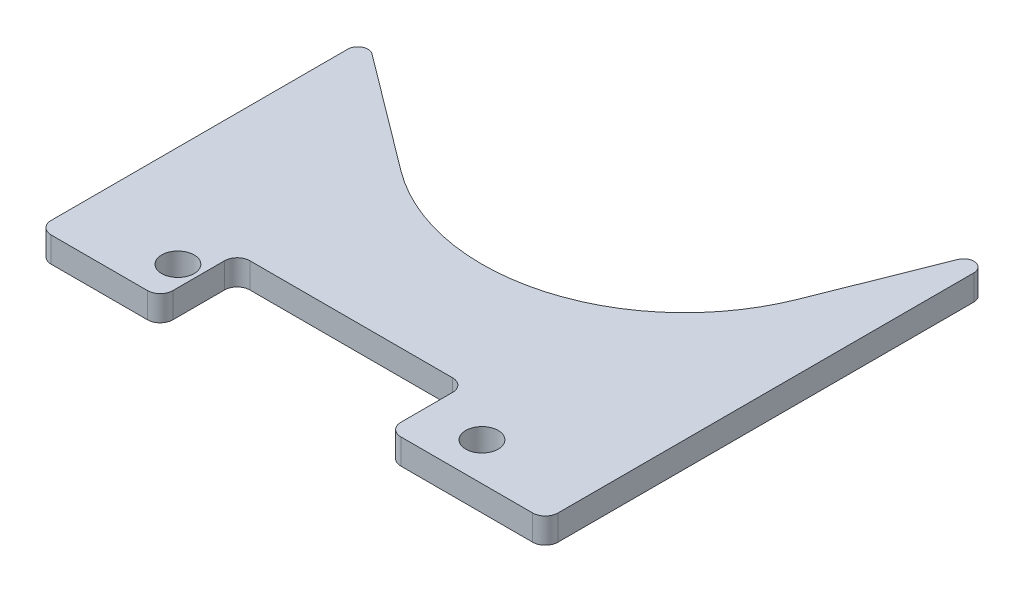
ISO-10303-21;
HEADER;
FILE_DESCRIPTION(('STEP AP214'),'2;1');
FILE_NAME('part.step','',(''),(''),'','','');
FILE_SCHEMA(('AUTOMOTIVE_DESIGN { 1 0 10303 214 1 1 1 1 }'));
ENDSEC;
DATA;
#1=APPLICATION_CONTEXT('core data for automotive mechanical design processes');
#2=APPLICATION_PROTOCOL_DEFINITION('international standard','automotive_design',2000,#1);
#3=PRODUCT_CONTEXT('',#1,'mechanical');
#4=PRODUCT('Part','Part','',(#3));
#5=PRODUCT_RELATED_PRODUCT_CATEGORY('part','',(#4));
#6=PRODUCT_DEFINITION_FORMATION('','',#4);
#7=PRODUCT_DEFINITION_CONTEXT('part definition',#1,'design');
#8=PRODUCT_DEFINITION('design','',#6,#7);
#9=PRODUCT_DEFINITION_SHAPE('','',#8);
#10=(LENGTH_UNIT() NAMED_UNIT(*) SI_UNIT(.MILLI.,.METRE.));
#11=(NAMED_UNIT(*) PLANE_ANGLE_UNIT() SI_UNIT($,.RADIAN.));
#12=(NAMED_UNIT(*) SI_UNIT($,.STERADIAN.) SOLID_ANGLE_UNIT());
#13=UNCERTAINTY_MEASURE_WITH_UNIT(LENGTH_MEASURE(1.E-05),#10,'distance_accuracy_value','');
#14=(GEOMETRIC_REPRESENTATION_CONTEXT(3) GLOBAL_UNCERTAINTY_ASSIGNED_CONTEXT((#13)) GLOBAL_UNIT_ASSIGNED_CONTEXT((#10,
#11,#12)) REPRESENTATION_CONTEXT('',''));
#15=CARTESIAN_POINT('',(0.,0.,0.));
#16=DIRECTION('',(0.,0.,1.));
#17=DIRECTION('',(1.,0.,0.));
#18=AXIS2_PLACEMENT_3D('',#15,#16,#17);
#19=CARTESIAN_POINT('',(-31.75,3.175,30.1625));
#20=DIRECTION('',(0.,0.,-1.));
#21=DIRECTION('',(-1.,0.,0.));
#22=AXIS2_PLACEMENT_3D('',#19,#20,#21);
#23=PLANE('',#22);
#24=DIRECTION('',(1.,0.,0.));
#25=VECTOR('',#24,1.);
#26=CARTESIAN_POINT('',(-31.75,3.175,30.1625));
#27=LINE('',#26,#25);
#28=CARTESIAN_POINT('',(-30.1625,3.175,30.1625));
#29=VERTEX_POINT('',#28);
#30=CARTESIAN_POINT('',(-18.0975,3.175,30.1625));
#31=VERTEX_POINT('',#30);
#32=EDGE_CURVE('E323',#29,#31,#27,.T.);
#33=ORIENTED_EDGE('',*,*,#32,.F.);
#34=DIRECTION('',(0.,-1.,0.));
#35=VECTOR('',#34,1.);
#36=CARTESIAN_POINT('',(-30.1625,3.175,30.1625));
#37=LINE('',#36,#35);
#38=CARTESIAN_POINT('',(-30.1625,0.,30.1625));
#39=VERTEX_POINT('',#38);
#40=EDGE_CURVE('E343',#29,#39,#37,.T.);
#41=ORIENTED_EDGE('',*,*,#40,.T.);
#42=DIRECTION('',(1.,0.,0.));
#43=VECTOR('',#42,1.);
#44=CARTESIAN_POINT('',(-31.75,0.,30.1625));
#45=LINE('',#44,#43);
#46=CARTESIAN_POINT('',(-18.0975,0.,30.1625));
#47=VERTEX_POINT('',#46);
#48=EDGE_CURVE('E338',#39,#47,#45,.T.);
#49=ORIENTED_EDGE('',*,*,#48,.T.);
#50=DIRECTION('',(0.,1.,0.));
#51=VECTOR('',#50,1.);
#52=CARTESIAN_POINT('',(-18.0975,3.175,30.1625));
#53=LINE('',#52,#51);
#54=EDGE_CURVE('E339',#47,#31,#53,.T.);
#55=ORIENTED_EDGE('',*,*,#54,.T.);
#56=EDGE_LOOP('',(#33,#41,#49,#55));
#57=FACE_BOUND('',#56,.T.);
#58=ADVANCED_FACE('F52',(#57),#23,.F.);
#59=CARTESIAN_POINT('',(31.75,3.175,-30.1625));
#60=DIRECTION('',(-1.,0.,0.));
#61=DIRECTION('',(0.,0.,1.));
#62=AXIS2_PLACEMENT_3D('',#59,#60,#61);
#63=PLANE('',#62);
#64=DIRECTION('',(0.,0.,-1.));
#65=VECTOR('',#64,1.);
#66=CARTESIAN_POINT('',(31.75,0.,-30.1625));
#67=LINE('',#66,#65);
#68=CARTESIAN_POINT('',(31.75,0.,28.575));
#69=VERTEX_POINT('',#68);
#70=CARTESIAN_POINT('',(31.75,0.,-23.5291490333497));
#71=VERTEX_POINT('',#70);
#72=EDGE_CURVE('E289',#69,#71,#67,.T.);
#73=ORIENTED_EDGE('',*,*,#72,.T.);
#74=DIRECTION('',(0.,-1.,0.));
#75=VECTOR('',#74,1.);
#76=CARTESIAN_POINT('',(31.75,3.175,-23.5291490333497));
#77=LINE('',#76,#75);
#78=CARTESIAN_POINT('',(31.75,3.175,-23.5291490333497));
#79=VERTEX_POINT('',#78);
#80=EDGE_CURVE('E442',#71,#79,#77,.F.);
#81=ORIENTED_EDGE('',*,*,#80,.T.);
#82=DIRECTION('',(0.,0.,-1.));
#83=VECTOR('',#82,1.);
#84=CARTESIAN_POINT('',(31.75,3.175,-30.1625));
#85=LINE('',#84,#83);
#86=CARTESIAN_POINT('',(31.75,3.175,28.575));
#87=VERTEX_POINT('',#86);
#88=EDGE_CURVE('E380',#87,#79,#85,.T.);
#89=ORIENTED_EDGE('',*,*,#88,.F.);
#90=DIRECTION('',(0.,-1.,0.));
#91=VECTOR('',#90,1.);
#92=CARTESIAN_POINT('',(31.75,3.175,28.575));
#93=LINE('',#92,#91);
#94=EDGE_CURVE('E420',#87,#69,#93,.T.);
#95=ORIENTED_EDGE('',*,*,#94,.T.);
#96=EDGE_LOOP('',(#73,#81,#89,#95));
#97=FACE_BOUND('',#96,.T.);
#98=ADVANCED_FACE('F464',(#97),#63,.F.);
#99=CARTESIAN_POINT('',(-31.75,3.175,-30.1625));
#100=DIRECTION('',(1.,0.,0.));
#101=DIRECTION('',(0.,0.,-1.));
#102=AXIS2_PLACEMENT_3D('',#99,#100,#101);
#103=PLANE('',#102);
#104=DIRECTION('',(0.,0.,1.));
#105=VECTOR('',#104,1.);
#106=CARTESIAN_POINT('',(-31.75,3.175,-30.1625));
#107=LINE('',#106,#105);
#108=CARTESIAN_POINT('',(-31.75,3.175,-8.5725));
#109=VERTEX_POINT('',#108);
#110=CARTESIAN_POINT('',(-31.75,3.175,28.575));
#111=VERTEX_POINT('',#110);
#112=EDGE_CURVE('E324',#109,#111,#107,.T.);
#113=ORIENTED_EDGE('',*,*,#112,.F.);
#114=DIRECTION('',(0.,1.,0.));
#115=VECTOR('',#114,1.);
#116=CARTESIAN_POINT('',(-31.75,3.175,-8.5725));
#117=LINE('',#116,#115);
#118=CARTESIAN_POINT('',(-31.75,0.,-8.5725));
#119=VERTEX_POINT('',#118);
#120=EDGE_CURVE('E12',#109,#119,#117,.F.);
#121=ORIENTED_EDGE('',*,*,#120,.T.);
#122=DIRECTION('',(0.,0.,1.));
#123=VECTOR('',#122,1.);
#124=CARTESIAN_POINT('',(-31.75,0.,-30.1625));
#125=LINE('',#124,#123);
#126=CARTESIAN_POINT('',(-31.75,0.,28.575));
#127=VERTEX_POINT('',#126);
#128=EDGE_CURVE('E331',#119,#127,#125,.T.);
#129=ORIENTED_EDGE('',*,*,#128,.T.);
#130=DIRECTION('',(0.,-1.,0.));
#131=VECTOR('',#130,1.);
#132=CARTESIAN_POINT('',(-31.75,3.175,28.575));
#133=LINE('',#132,#131);
#134=EDGE_CURVE('E302',#127,#111,#133,.F.);
#135=ORIENTED_EDGE('',*,*,#134,.T.);
#136=EDGE_LOOP('',(#113,#121,#129,#135));
#137=FACE_BOUND('',#136,.T.);
#138=ADVANCED_FACE('F365',(#137),#103,.F.);
#139=CARTESIAN_POINT('',(13.6525,3.175,30.1625));
#140=VERTEX_POINT('',#139);
#141=CARTESIAN_POINT('',(30.1625,3.175,30.1625));
#142=VERTEX_POINT('',#141);
#143=EDGE_CURVE('E318',#140,#142,#27,.T.);
#144=ORIENTED_EDGE('',*,*,#143,.F.);
#145=DIRECTION('',(0.,1.,0.));
#146=VECTOR('',#145,1.);
#147=CARTESIAN_POINT('',(13.6525,3.175,30.1625));
#148=LINE('',#147,#146);
#149=CARTESIAN_POINT('',(13.6525,0.,30.1625));
#150=VERTEX_POINT('',#149);
#151=EDGE_CURVE('E412',#140,#150,#148,.F.);
#152=ORIENTED_EDGE('',*,*,#151,.T.);
#153=CARTESIAN_POINT('',(30.1625,0.,30.1625));
#154=VERTEX_POINT('',#153);
#155=EDGE_CURVE('E334',#150,#154,#45,.T.);
#156=ORIENTED_EDGE('',*,*,#155,.T.);
#157=DIRECTION('',(0.,-1.,0.));
#158=VECTOR('',#157,1.);
#159=CARTESIAN_POINT('',(30.1625,3.175,30.1625));
#160=LINE('',#159,#158);
#161=EDGE_CURVE('E408',#154,#142,#160,.F.);
#162=ORIENTED_EDGE('',*,*,#161,.T.);
#163=EDGE_LOOP('',(#144,#152,#156,#162));
#164=FACE_BOUND('',#163,.T.);
#165=ADVANCED_FACE('F475',(#164),#23,.F.);
#166=CARTESIAN_POINT('',(0.,3.175,0.));
#167=DIRECTION('',(0.,1.,0.));
#168=DIRECTION('',(0.,0.,1.));
#169=AXIS2_PLACEMENT_3D('',#166,#167,#168);
#170=PLANE('',#169);
#171=ORIENTED_EDGE('',*,*,#88,.T.);
#172=CARTESIAN_POINT('',(30.48,3.175,-23.5291490333497));
#173=DIRECTION('',(0.,1.,0.));
#174=DIRECTION('',(0.,0.,1.));
#175=AXIS2_PLACEMENT_3D('',#172,#173,#174);
#176=CIRCLE('',#175,1.27);
#177=CARTESIAN_POINT('',(29.2998133027479,3.175,-23.9982538826415));
#178=VERTEX_POINT('',#177);
#179=EDGE_CURVE('E447',#79,#178,#176,.T.);
#180=ORIENTED_EDGE('',*,*,#179,.T.);
#181=DIRECTION('',(0.369373897080169,0.,-0.929280863978059));
#182=VECTOR('',#181,1.);
#183=CARTESIAN_POINT('',(23.6037339450427,3.175,-9.66790301416369));
#184=LINE('',#183,#182);
#185=CARTESIAN_POINT('',(23.6037339450427,3.175,-9.66790301416369));
#186=VERTEX_POINT('',#185);
#187=EDGE_CURVE('E231',#186,#178,#184,.T.);
#188=ORIENTED_EDGE('',*,*,#187,.F.);
#189=CARTESIAN_POINT('',(0.,3.175,-19.05));
#190=DIRECTION('',(0.,1.,0.));
#191=DIRECTION('',(0.,0.,1.));
#192=AXIS2_PLACEMENT_3D('',#189,#190,#191);
#193=CIRCLE('',#192,25.4);
#194=CARTESIAN_POINT('',(-15.24,3.175,1.27));
#195=VERTEX_POINT('',#194);
#196=EDGE_CURVE('E207',#195,#186,#193,.T.);
#197=ORIENTED_EDGE('',*,*,#196,.F.);
#198=DIRECTION('',(0.8,0.,0.599999999999999));
#199=VECTOR('',#198,1.);
#200=CARTESIAN_POINT('',(-15.24,3.175,1.27));
#201=LINE('',#200,#199);
#202=CARTESIAN_POINT('',(-29.718,3.175,-9.5885));
#203=VERTEX_POINT('',#202);
#204=EDGE_CURVE('E228',#203,#195,#201,.T.);
#205=ORIENTED_EDGE('',*,*,#204,.F.);
#206=CARTESIAN_POINT('',(-30.48,3.175,-8.5725));
#207=DIRECTION('',(0.,1.,0.));
#208=DIRECTION('',(0.,0.,1.));
#209=AXIS2_PLACEMENT_3D('',#206,#207,#208);
#210=CIRCLE('',#209,1.27);
#211=EDGE_CURVE('E68',#203,#109,#210,.T.);
#212=ORIENTED_EDGE('',*,*,#211,.T.);
#213=ORIENTED_EDGE('',*,*,#112,.T.);
#214=CARTESIAN_POINT('',(-30.1625,3.175,28.575));
#215=DIRECTION('',(0.,1.,0.));
#216=DIRECTION('',(0.,0.,1.));
#217=AXIS2_PLACEMENT_3D('',#214,#215,#216);
#218=CIRCLE('',#217,1.5875);
#219=EDGE_CURVE('E310',#111,#29,#218,.T.);
#220=ORIENTED_EDGE('',*,*,#219,.T.);
#221=ORIENTED_EDGE('',*,*,#32,.T.);
#222=CARTESIAN_POINT('',(-18.0975,3.175,28.575));
#223=DIRECTION('',(0.,1.,0.));
#224=DIRECTION('',(0.,0.,1.));
#225=AXIS2_PLACEMENT_3D('',#222,#223,#224);
#226=CIRCLE('',#225,1.5875);
#227=CARTESIAN_POINT('',(-16.51,3.175,28.575));
#228=VERTEX_POINT('',#227);
#229=EDGE_CURVE('E306',#31,#228,#226,.T.);
#230=ORIENTED_EDGE('',*,*,#229,.T.);
#231=DIRECTION('',(0.,0.,1.));
#232=VECTOR('',#231,1.);
#233=CARTESIAN_POINT('',(-16.51,3.175,30.1625));
#234=LINE('',#233,#232);
#235=CARTESIAN_POINT('',(-16.51,3.175,22.098));
#236=VERTEX_POINT('',#235);
#237=EDGE_CURVE('E250',#236,#228,#234,.T.);
#238=ORIENTED_EDGE('',*,*,#237,.F.);
#239=CARTESIAN_POINT('',(-14.9225,3.175,22.098));
#240=DIRECTION('',(0.,1.,0.));
#241=DIRECTION('',(0.,0.,1.));
#242=AXIS2_PLACEMENT_3D('',#239,#240,#241);
#243=CIRCLE('',#242,1.5875);
#244=CARTESIAN_POINT('',(-14.9225,3.175,20.5105));
#245=VERTEX_POINT('',#244);
#246=EDGE_CURVE('E424',#236,#245,#243,.F.);
#247=ORIENTED_EDGE('',*,*,#246,.T.);
#248=DIRECTION('',(-1.,0.,0.));
#249=VECTOR('',#248,1.);
#250=CARTESIAN_POINT('',(-16.51,3.175,20.5105));
#251=LINE('',#250,#249);
#252=CARTESIAN_POINT('',(10.4775,3.175,20.5105));
#253=VERTEX_POINT('',#252);
#254=EDGE_CURVE('E257',#253,#245,#251,.T.);
#255=ORIENTED_EDGE('',*,*,#254,.F.);
#256=CARTESIAN_POINT('',(10.4775,3.175,22.098));
#257=DIRECTION('',(0.,1.,0.));
#258=DIRECTION('',(0.,0.,1.));
#259=AXIS2_PLACEMENT_3D('',#256,#257,#258);
#260=CIRCLE('',#259,1.5875);
#261=CARTESIAN_POINT('',(12.065,3.175,22.098));
#262=VERTEX_POINT('',#261);
#263=EDGE_CURVE('E404',#253,#262,#260,.F.);
#264=ORIENTED_EDGE('',*,*,#263,.T.);
#265=DIRECTION('',(0.,0.,-1.));
#266=VECTOR('',#265,1.);
#267=CARTESIAN_POINT('',(12.065,3.175,30.1625));
#268=LINE('',#267,#266);
#269=CARTESIAN_POINT('',(12.065,3.175,28.575));
#270=VERTEX_POINT('',#269);
#271=EDGE_CURVE('E270',#270,#262,#268,.T.);
#272=ORIENTED_EDGE('',*,*,#271,.F.);
#273=CARTESIAN_POINT('',(13.6525,3.175,28.575));
#274=DIRECTION('',(0.,1.,0.));
#275=DIRECTION('',(0.,0.,1.));
#276=AXIS2_PLACEMENT_3D('',#273,#274,#275);
#277=CIRCLE('',#276,1.5875);
#278=EDGE_CURVE('E301',#270,#140,#277,.T.);
#279=ORIENTED_EDGE('',*,*,#278,.T.);
#280=ORIENTED_EDGE('',*,*,#143,.T.);
#281=CARTESIAN_POINT('',(30.1625,3.175,28.575));
#282=DIRECTION('',(0.,1.,0.));
#283=DIRECTION('',(0.,0.,1.));
#284=AXIS2_PLACEMENT_3D('',#281,#282,#283);
#285=CIRCLE('',#284,1.5875);
#286=EDGE_CURVE('E296',#142,#87,#285,.T.);
#287=ORIENTED_EDGE('',*,*,#286,.T.);
#288=EDGE_LOOP('',(#171,#180,#188,#197,#205,#212,#213,#220,#221,#230,#238,#247,#255,#264,#272,
#279,#280,#287));
#289=FACE_BOUND('',#288,.T.);
#290=CARTESIAN_POINT('',(19.05,3.175,25.4));
#291=DIRECTION('',(0.,-1.,0.));
#292=DIRECTION('',(0.,0.,-1.));
#293=AXIS2_PLACEMENT_3D('',#290,#291,#292);
#294=CIRCLE('',#293,2.032);
#295=CARTESIAN_POINT('',(19.05,3.175,23.368));
#296=VERTEX_POINT('',#295);
#297=EDGE_CURVE('E284',#296,#296,#294,.T.);
#298=ORIENTED_EDGE('',*,*,#297,.T.);
#299=EDGE_LOOP('',(#298));
#300=FACE_BOUND('',#299,.T.);
#301=CARTESIAN_POINT('',(-19.05,3.175,25.4));
#302=DIRECTION('',(0.,-1.,0.));
#303=DIRECTION('',(0.,0.,-1.));
#304=AXIS2_PLACEMENT_3D('',#301,#302,#303);
#305=CIRCLE('',#304,2.032);
#306=CARTESIAN_POINT('',(-19.05,3.175,23.368));
#307=VERTEX_POINT('',#306);
#308=EDGE_CURVE('E265',#307,#307,#305,.T.);
#309=ORIENTED_EDGE('',*,*,#308,.T.);
#310=EDGE_LOOP('',(#309));
#311=FACE_BOUND('',#310,.T.);
#312=ADVANCED_FACE('F372',(#289,#300,#311),#170,.T.);
#313=CARTESIAN_POINT('',(0.,0.,0.));
#314=DIRECTION('',(0.,1.,0.));
#315=DIRECTION('',(0.,0.,1.));
#316=AXIS2_PLACEMENT_3D('',#313,#314,#315);
#317=PLANE('',#316);
#318=CARTESIAN_POINT('',(19.05,0.,25.4));
#319=DIRECTION('',(0.,-1.,0.));
#320=DIRECTION('',(0.,0.,-1.));
#321=AXIS2_PLACEMENT_3D('',#318,#319,#320);
#322=CIRCLE('',#321,2.032);
#323=CARTESIAN_POINT('',(19.05,0.,23.368));
#324=VERTEX_POINT('',#323);
#325=EDGE_CURVE('E290',#324,#324,#322,.T.);
#326=ORIENTED_EDGE('',*,*,#325,.F.);
#327=EDGE_LOOP('',(#326));
#328=FACE_BOUND('',#327,.T.);
#329=CARTESIAN_POINT('',(-19.05,0.,25.4));
#330=DIRECTION('',(0.,-1.,0.));
#331=DIRECTION('',(0.,0.,-1.));
#332=AXIS2_PLACEMENT_3D('',#329,#330,#331);
#333=CIRCLE('',#332,2.032);
#334=CARTESIAN_POINT('',(-19.05,0.,23.368));
#335=VERTEX_POINT('',#334);
#336=EDGE_CURVE('E385',#335,#335,#333,.T.);
#337=ORIENTED_EDGE('',*,*,#336,.F.);
#338=EDGE_LOOP('',(#337));
#339=FACE_BOUND('',#338,.T.);
#340=DIRECTION('',(0.369373897080169,0.,-0.929280863978059));
#341=VECTOR('',#340,1.);
#342=CARTESIAN_POINT('',(23.6037339450427,0.,-9.66790301416369));
#343=LINE('',#342,#341);
#344=CARTESIAN_POINT('',(23.6037339450427,0.,-9.66790301416369));
#345=VERTEX_POINT('',#344);
#346=CARTESIAN_POINT('',(29.2998133027479,0.,-23.9982538826415));
#347=VERTEX_POINT('',#346);
#348=EDGE_CURVE('E217',#345,#347,#343,.T.);
#349=ORIENTED_EDGE('',*,*,#348,.T.);
#350=CARTESIAN_POINT('',(30.48,0.,-23.5291490333497));
#351=DIRECTION('',(0.,1.,0.));
#352=DIRECTION('',(0.,0.,1.));
#353=AXIS2_PLACEMENT_3D('',#350,#351,#352);
#354=CIRCLE('',#353,1.27);
#355=EDGE_CURVE('E439',#347,#71,#354,.F.);
#356=ORIENTED_EDGE('',*,*,#355,.T.);
#357=ORIENTED_EDGE('',*,*,#72,.F.);
#358=CARTESIAN_POINT('',(30.1625,0.,28.575));
#359=DIRECTION('',(0.,1.,0.));
#360=DIRECTION('',(0.,0.,1.));
#361=AXIS2_PLACEMENT_3D('',#358,#359,#360);
#362=CIRCLE('',#361,1.5875);
#363=EDGE_CURVE('E347',#69,#154,#362,.F.);
#364=ORIENTED_EDGE('',*,*,#363,.T.);
#365=ORIENTED_EDGE('',*,*,#155,.F.);
#366=CARTESIAN_POINT('',(13.6525,0.,28.575));
#367=DIRECTION('',(0.,1.,0.));
#368=DIRECTION('',(0.,0.,1.));
#369=AXIS2_PLACEMENT_3D('',#366,#367,#368);
#370=CIRCLE('',#369,1.5875);
#371=CARTESIAN_POINT('',(12.065,0.,28.575));
#372=VERTEX_POINT('',#371);
#373=EDGE_CURVE('E350',#150,#372,#370,.F.);
#374=ORIENTED_EDGE('',*,*,#373,.T.);
#375=DIRECTION('',(0.,0.,-1.));
#376=VECTOR('',#375,1.);
#377=CARTESIAN_POINT('',(12.065,0.,30.1625));
#378=LINE('',#377,#376);
#379=CARTESIAN_POINT('',(12.065,0.,22.098));
#380=VERTEX_POINT('',#379);
#381=EDGE_CURVE('E256',#372,#380,#378,.T.);
#382=ORIENTED_EDGE('',*,*,#381,.T.);
#383=CARTESIAN_POINT('',(10.4775,0.,22.098));
#384=DIRECTION('',(0.,1.,0.));
#385=DIRECTION('',(0.,0.,1.));
#386=AXIS2_PLACEMENT_3D('',#383,#384,#385);
#387=CIRCLE('',#386,1.5875);
#388=CARTESIAN_POINT('',(10.4775,0.,20.5105));
#389=VERTEX_POINT('',#388);
#390=EDGE_CURVE('E406',#380,#389,#387,.T.);
#391=ORIENTED_EDGE('',*,*,#390,.T.);
#392=DIRECTION('',(-1.,0.,0.));
#393=VECTOR('',#392,1.);
#394=CARTESIAN_POINT('',(-16.51,0.,20.5105));
#395=LINE('',#394,#393);
#396=CARTESIAN_POINT('',(-14.9225,0.,20.5105));
#397=VERTEX_POINT('',#396);
#398=EDGE_CURVE('E261',#389,#397,#395,.T.);
#399=ORIENTED_EDGE('',*,*,#398,.T.);
#400=CARTESIAN_POINT('',(-14.9225,0.,22.098));
#401=DIRECTION('',(0.,1.,0.));
#402=DIRECTION('',(0.,0.,1.));
#403=AXIS2_PLACEMENT_3D('',#400,#401,#402);
#404=CIRCLE('',#403,1.5875);
#405=CARTESIAN_POINT('',(-16.51,0.,22.098));
#406=VERTEX_POINT('',#405);
#407=EDGE_CURVE('E427',#397,#406,#404,.T.);
#408=ORIENTED_EDGE('',*,*,#407,.T.);
#409=DIRECTION('',(0.,0.,1.));
#410=VECTOR('',#409,1.);
#411=CARTESIAN_POINT('',(-16.51,0.,30.1625));
#412=LINE('',#411,#410);
#413=CARTESIAN_POINT('',(-16.51,0.,28.575));
#414=VERTEX_POINT('',#413);
#415=EDGE_CURVE('E252',#406,#414,#412,.T.);
#416=ORIENTED_EDGE('',*,*,#415,.T.);
#417=CARTESIAN_POINT('',(-18.0975,0.,28.575));
#418=DIRECTION('',(0.,1.,0.));
#419=DIRECTION('',(0.,0.,1.));
#420=AXIS2_PLACEMENT_3D('',#417,#418,#419);
#421=CIRCLE('',#420,1.5875);
#422=EDGE_CURVE('E353',#414,#47,#421,.F.);
#423=ORIENTED_EDGE('',*,*,#422,.T.);
#424=ORIENTED_EDGE('',*,*,#48,.F.);
#425=CARTESIAN_POINT('',(-30.1625,0.,28.575));
#426=DIRECTION('',(0.,1.,0.));
#427=DIRECTION('',(0.,0.,1.));
#428=AXIS2_PLACEMENT_3D('',#425,#426,#427);
#429=CIRCLE('',#428,1.5875);
#430=EDGE_CURVE('E355',#39,#127,#429,.F.);
#431=ORIENTED_EDGE('',*,*,#430,.T.);
#432=ORIENTED_EDGE('',*,*,#128,.F.);
#433=CARTESIAN_POINT('',(-30.48,0.,-8.5725));
#434=DIRECTION('',(0.,1.,0.));
#435=DIRECTION('',(0.,0.,1.));
#436=AXIS2_PLACEMENT_3D('',#433,#434,#435);
#437=CIRCLE('',#436,1.27);
#438=CARTESIAN_POINT('',(-29.718,0.,-9.5885));
#439=VERTEX_POINT('',#438);
#440=EDGE_CURVE('E436',#119,#439,#437,.F.);
#441=ORIENTED_EDGE('',*,*,#440,.T.);
#442=DIRECTION('',(0.8,0.,0.599999999999999));
#443=VECTOR('',#442,1.);
#444=CARTESIAN_POINT('',(-15.24,0.,1.27));
#445=LINE('',#444,#443);
#446=CARTESIAN_POINT('',(-15.24,0.,1.27));
#447=VERTEX_POINT('',#446);
#448=EDGE_CURVE('E213',#439,#447,#445,.T.);
#449=ORIENTED_EDGE('',*,*,#448,.T.);
#450=CARTESIAN_POINT('',(0.,0.,-19.05));
#451=DIRECTION('',(0.,1.,0.));
#452=DIRECTION('',(0.,0.,1.));
#453=AXIS2_PLACEMENT_3D('',#450,#451,#452);
#454=CIRCLE('',#453,25.4);
#455=EDGE_CURVE('E205',#447,#345,#454,.T.);
#456=ORIENTED_EDGE('',*,*,#455,.T.);
#457=EDGE_LOOP('',(#349,#356,#357,#364,#365,#374,#382,#391,#399,#408,#416,#423,#424,#431,#432,
#441,#449,#456));
#458=FACE_BOUND('',#457,.T.);
#459=ADVANCED_FACE('F224',(#328,#339,#458),#317,.F.);
#460=CARTESIAN_POINT('',(-19.05,3.175,25.4));
#461=DIRECTION('',(0.,-1.,0.));
#462=DIRECTION('',(0.,0.,-1.));
#463=AXIS2_PLACEMENT_3D('',#460,#461,#462);
#464=CYLINDRICAL_SURFACE('',#463,2.032);
#465=ORIENTED_EDGE('',*,*,#308,.F.);
#466=EDGE_LOOP('',(#465));
#467=FACE_BOUND('',#466,.T.);
#468=ORIENTED_EDGE('',*,*,#336,.T.);
#469=EDGE_LOOP('',(#468));
#470=FACE_BOUND('',#469,.T.);
#471=ADVANCED_FACE('F546',(#467,#470),#464,.F.);
#472=CARTESIAN_POINT('',(19.05,3.175,25.4));
#473=DIRECTION('',(0.,-1.,0.));
#474=DIRECTION('',(0.,0.,-1.));
#475=AXIS2_PLACEMENT_3D('',#472,#473,#474);
#476=CYLINDRICAL_SURFACE('',#475,2.032);
#477=ORIENTED_EDGE('',*,*,#297,.F.);
#478=EDGE_LOOP('',(#477));
#479=FACE_BOUND('',#478,.T.);
#480=ORIENTED_EDGE('',*,*,#325,.T.);
#481=EDGE_LOOP('',(#480));
#482=FACE_BOUND('',#481,.T.);
#483=ADVANCED_FACE('F543',(#479,#482),#476,.F.);
#484=CARTESIAN_POINT('',(-16.51,0.,30.1625));
#485=DIRECTION('',(-1.,0.,0.));
#486=DIRECTION('',(0.,0.,1.));
#487=AXIS2_PLACEMENT_3D('',#484,#485,#486);
#488=PLANE('',#487);
#489=ORIENTED_EDGE('',*,*,#237,.T.);
#490=DIRECTION('',(0.,1.,0.));
#491=VECTOR('',#490,1.);
#492=CARTESIAN_POINT('',(-16.51,0.,28.575));
#493=LINE('',#492,#491);
#494=EDGE_CURVE('E487',#228,#414,#493,.F.);
#495=ORIENTED_EDGE('',*,*,#494,.T.);
#496=ORIENTED_EDGE('',*,*,#415,.F.);
#497=DIRECTION('',(0.,1.,0.));
#498=VECTOR('',#497,1.);
#499=CARTESIAN_POINT('',(-16.51,3.175,22.098));
#500=LINE('',#499,#498);
#501=EDGE_CURVE('E314',#406,#236,#500,.T.);
#502=ORIENTED_EDGE('',*,*,#501,.T.);
#503=EDGE_LOOP('',(#489,#495,#496,#502));
#504=FACE_BOUND('',#503,.T.);
#505=ADVANCED_FACE('F498',(#504),#488,.F.);
#506=CARTESIAN_POINT('',(-16.51,0.,20.5105));
#507=DIRECTION('',(0.,0.,-1.));
#508=DIRECTION('',(-1.,0.,0.));
#509=AXIS2_PLACEMENT_3D('',#506,#507,#508);
#510=PLANE('',#509);
#511=ORIENTED_EDGE('',*,*,#254,.T.);
#512=DIRECTION('',(0.,1.,0.));
#513=VECTOR('',#512,1.);
#514=CARTESIAN_POINT('',(-14.9225,0.,20.5105));
#515=LINE('',#514,#513);
#516=EDGE_CURVE('E414',#245,#397,#515,.F.);
#517=ORIENTED_EDGE('',*,*,#516,.T.);
#518=ORIENTED_EDGE('',*,*,#398,.F.);
#519=DIRECTION('',(0.,1.,0.));
#520=VECTOR('',#519,1.);
#521=CARTESIAN_POINT('',(10.4775,3.175,20.5105));
#522=LINE('',#521,#520);
#523=EDGE_CURVE('E483',#389,#253,#522,.T.);
#524=ORIENTED_EDGE('',*,*,#523,.T.);
#525=EDGE_LOOP('',(#511,#517,#518,#524));
#526=FACE_BOUND('',#525,.T.);
#527=ADVANCED_FACE('F482',(#526),#510,.F.);
#528=CARTESIAN_POINT('',(12.065,0.,30.1625));
#529=DIRECTION('',(1.,0.,0.));
#530=DIRECTION('',(0.,0.,-1.));
#531=AXIS2_PLACEMENT_3D('',#528,#529,#530);
#532=PLANE('',#531);
#533=ORIENTED_EDGE('',*,*,#271,.T.);
#534=DIRECTION('',(0.,1.,0.));
#535=VECTOR('',#534,1.);
#536=CARTESIAN_POINT('',(12.065,0.,22.098));
#537=LINE('',#536,#535);
#538=EDGE_CURVE('E397',#262,#380,#537,.F.);
#539=ORIENTED_EDGE('',*,*,#538,.T.);
#540=ORIENTED_EDGE('',*,*,#381,.F.);
#541=DIRECTION('',(0.,1.,0.));
#542=VECTOR('',#541,1.);
#543=CARTESIAN_POINT('',(12.065,0.,28.575));
#544=LINE('',#543,#542);
#545=EDGE_CURVE('E399',#372,#270,#544,.T.);
#546=ORIENTED_EDGE('',*,*,#545,.T.);
#547=EDGE_LOOP('',(#533,#539,#540,#546));
#548=FACE_BOUND('',#547,.T.);
#549=ADVANCED_FACE('F395',(#548),#532,.F.);
#550=CARTESIAN_POINT('',(-30.1625,3.175,28.575));
#551=DIRECTION('',(0.,-1.,0.));
#552=DIRECTION('',(0.,0.,-1.));
#553=AXIS2_PLACEMENT_3D('',#550,#551,#552);
#554=CYLINDRICAL_SURFACE('',#553,1.5875);
#555=ORIENTED_EDGE('',*,*,#219,.F.);
#556=ORIENTED_EDGE('',*,*,#134,.F.);
#557=ORIENTED_EDGE('',*,*,#430,.F.);
#558=ORIENTED_EDGE('',*,*,#40,.F.);
#559=EDGE_LOOP('',(#555,#556,#557,#558));
#560=FACE_BOUND('',#559,.T.);
#561=ADVANCED_FACE('F368',(#560),#554,.T.);
#562=CARTESIAN_POINT('',(-18.0975,3.175,28.575));
#563=DIRECTION('',(0.,1.,0.));
#564=DIRECTION('',(0.,0.,1.));
#565=AXIS2_PLACEMENT_3D('',#562,#563,#564);
#566=CYLINDRICAL_SURFACE('',#565,1.5875);
#567=ORIENTED_EDGE('',*,*,#422,.F.);
#568=ORIENTED_EDGE('',*,*,#494,.F.);
#569=ORIENTED_EDGE('',*,*,#229,.F.);
#570=ORIENTED_EDGE('',*,*,#54,.F.);
#571=EDGE_LOOP('',(#567,#568,#569,#570));
#572=FACE_BOUND('',#571,.T.);
#573=ADVANCED_FACE('F502',(#572),#566,.T.);
#574=CARTESIAN_POINT('',(-14.9225,0.,22.098));
#575=DIRECTION('',(0.,-1.,0.));
#576=DIRECTION('',(0.,0.,-1.));
#577=AXIS2_PLACEMENT_3D('',#574,#575,#576);
#578=CYLINDRICAL_SURFACE('',#577,1.5875);
#579=ORIENTED_EDGE('',*,*,#407,.F.);
#580=ORIENTED_EDGE('',*,*,#516,.F.);
#581=ORIENTED_EDGE('',*,*,#246,.F.);
#582=ORIENTED_EDGE('',*,*,#501,.F.);
#583=EDGE_LOOP('',(#579,#580,#581,#582));
#584=FACE_BOUND('',#583,.T.);
#585=ADVANCED_FACE('F503',(#584),#578,.F.);
#586=CARTESIAN_POINT('',(10.4775,0.,22.098));
#587=DIRECTION('',(0.,-1.,0.));
#588=DIRECTION('',(0.,0.,-1.));
#589=AXIS2_PLACEMENT_3D('',#586,#587,#588);
#590=CYLINDRICAL_SURFACE('',#589,1.5875);
#591=ORIENTED_EDGE('',*,*,#390,.F.);
#592=ORIENTED_EDGE('',*,*,#538,.F.);
#593=ORIENTED_EDGE('',*,*,#263,.F.);
#594=ORIENTED_EDGE('',*,*,#523,.F.);
#595=EDGE_LOOP('',(#591,#592,#593,#594));
#596=FACE_BOUND('',#595,.T.);
#597=ADVANCED_FACE('F402',(#596),#590,.F.);
#598=CARTESIAN_POINT('',(13.6525,0.,28.575));
#599=DIRECTION('',(0.,1.,0.));
#600=DIRECTION('',(0.,0.,1.));
#601=AXIS2_PLACEMENT_3D('',#598,#599,#600);
#602=CYLINDRICAL_SURFACE('',#601,1.5875);
#603=ORIENTED_EDGE('',*,*,#373,.F.);
#604=ORIENTED_EDGE('',*,*,#151,.F.);
#605=ORIENTED_EDGE('',*,*,#278,.F.);
#606=ORIENTED_EDGE('',*,*,#545,.F.);
#607=EDGE_LOOP('',(#603,#604,#605,#606));
#608=FACE_BOUND('',#607,.T.);
#609=ADVANCED_FACE('F478',(#608),#602,.T.);
#610=CARTESIAN_POINT('',(30.1625,3.175,28.575));
#611=DIRECTION('',(0.,-1.,0.));
#612=DIRECTION('',(0.,0.,-1.));
#613=AXIS2_PLACEMENT_3D('',#610,#611,#612);
#614=CYLINDRICAL_SURFACE('',#613,1.5875);
#615=ORIENTED_EDGE('',*,*,#286,.F.);
#616=ORIENTED_EDGE('',*,*,#161,.F.);
#617=ORIENTED_EDGE('',*,*,#363,.F.);
#618=ORIENTED_EDGE('',*,*,#94,.F.);
#619=EDGE_LOOP('',(#615,#616,#617,#618));
#620=FACE_BOUND('',#619,.T.);
#621=ADVANCED_FACE('F469',(#620),#614,.T.);
#622=CARTESIAN_POINT('',(0.,0.,-19.05));
#623=DIRECTION('',(0.,1.,0.));
#624=DIRECTION('',(0.,0.,1.));
#625=AXIS2_PLACEMENT_3D('',#622,#623,#624);
#626=CYLINDRICAL_SURFACE('',#625,25.4);
#627=ORIENTED_EDGE('',*,*,#196,.T.);
#628=DIRECTION('',(0.,1.,0.));
#629=VECTOR('',#628,1.);
#630=CARTESIAN_POINT('',(23.6037339450427,0.,-9.66790301416369));
#631=LINE('',#630,#629);
#632=EDGE_CURVE('E200',#345,#186,#631,.T.);
#633=ORIENTED_EDGE('',*,*,#632,.F.);
#634=ORIENTED_EDGE('',*,*,#455,.F.);
#635=DIRECTION('',(0.,1.,0.));
#636=VECTOR('',#635,1.);
#637=CARTESIAN_POINT('',(-15.24,0.,1.27));
#638=LINE('',#637,#636);
#639=EDGE_CURVE('E212',#447,#195,#638,.T.);
#640=ORIENTED_EDGE('',*,*,#639,.T.);
#641=EDGE_LOOP('',(#627,#633,#634,#640));
#642=FACE_BOUND('',#641,.T.);
#643=ADVANCED_FACE('F202',(#642),#626,.F.);
#644=CARTESIAN_POINT('',(-15.24,0.,1.27));
#645=DIRECTION('',(-0.599999999999999,0.,0.8));
#646=DIRECTION('',(0.8,0.,0.599999999999999));
#647=AXIS2_PLACEMENT_3D('',#644,#645,#646);
#648=PLANE('',#647);
#649=ORIENTED_EDGE('',*,*,#448,.F.);
#650=DIRECTION('',(0.,1.,0.));
#651=VECTOR('',#650,1.);
#652=CARTESIAN_POINT('',(-29.718,0.,-9.5885));
#653=LINE('',#652,#651);
#654=EDGE_CURVE('E61',#439,#203,#653,.T.);
#655=ORIENTED_EDGE('',*,*,#654,.T.);
#656=ORIENTED_EDGE('',*,*,#204,.T.);
#657=ORIENTED_EDGE('',*,*,#639,.F.);
#658=EDGE_LOOP('',(#649,#655,#656,#657));
#659=FACE_BOUND('',#658,.T.);
#660=ADVANCED_FACE('F455',(#659),#648,.F.);
#661=CARTESIAN_POINT('',(23.6037339450427,0.,-9.66790301416369));
#662=DIRECTION('',(0.929280863978059,0.,0.369373897080169));
#663=DIRECTION('',(0.369373897080169,0.,-0.92928086397806));
#664=AXIS2_PLACEMENT_3D('',#661,#662,#663);
#665=PLANE('',#664);
#666=ORIENTED_EDGE('',*,*,#187,.T.);
#667=DIRECTION('',(0.,-1.,0.));
#668=VECTOR('',#667,1.);
#669=CARTESIAN_POINT('',(29.2998133027479,0.,-23.9982538826415));
#670=LINE('',#669,#668);
#671=EDGE_CURVE('E220',#178,#347,#670,.T.);
#672=ORIENTED_EDGE('',*,*,#671,.T.);
#673=ORIENTED_EDGE('',*,*,#348,.F.);
#674=ORIENTED_EDGE('',*,*,#632,.T.);
#675=EDGE_LOOP('',(#666,#672,#673,#674));
#676=FACE_BOUND('',#675,.T.);
#677=ADVANCED_FACE('F218',(#676),#665,.F.);
#678=CARTESIAN_POINT('',(30.48,0.,-23.5291490333497));
#679=DIRECTION('',(0.,-1.,0.));
#680=DIRECTION('',(0.,0.,-1.));
#681=AXIS2_PLACEMENT_3D('',#678,#679,#680);
#682=CYLINDRICAL_SURFACE('',#681,1.27);
#683=ORIENTED_EDGE('',*,*,#179,.F.);
#684=ORIENTED_EDGE('',*,*,#80,.F.);
#685=ORIENTED_EDGE('',*,*,#355,.F.);
#686=ORIENTED_EDGE('',*,*,#671,.F.);
#687=EDGE_LOOP('',(#683,#684,#685,#686));
#688=FACE_BOUND('',#687,.T.);
#689=ADVANCED_FACE('F460',(#688),#682,.T.);
#690=CARTESIAN_POINT('',(-30.48,0.,-8.5725));
#691=DIRECTION('',(0.,1.,0.));
#692=DIRECTION('',(0.,0.,1.));
#693=AXIS2_PLACEMENT_3D('',#690,#691,#692);
#694=CYLINDRICAL_SURFACE('',#693,1.27);
#695=ORIENTED_EDGE('',*,*,#440,.F.);
#696=ORIENTED_EDGE('',*,*,#120,.F.);
#697=ORIENTED_EDGE('',*,*,#211,.F.);
#698=ORIENTED_EDGE('',*,*,#654,.F.);
#699=EDGE_LOOP('',(#695,#696,#697,#698));
#700=FACE_BOUND('',#699,.T.);
#701=ADVANCED_FACE('F54',(#700),#694,.T.);
#702=CLOSED_SHELL('',(#58,#98,#138,#165,#312,#459,#471,#483,#505,#527,#549,#561,#573,#585,#597,
#609,#621,#643,#660,#677,#689,#701));
#703=MANIFOLD_SOLID_BREP('B2',#702);
#704=ADVANCED_BREP_SHAPE_REPRESENTATION('',(#18,#703),#14);
#705=SHAPE_DEFINITION_REPRESENTATION(#9,#704);
ENDSEC;
END-ISO-10303-21;
